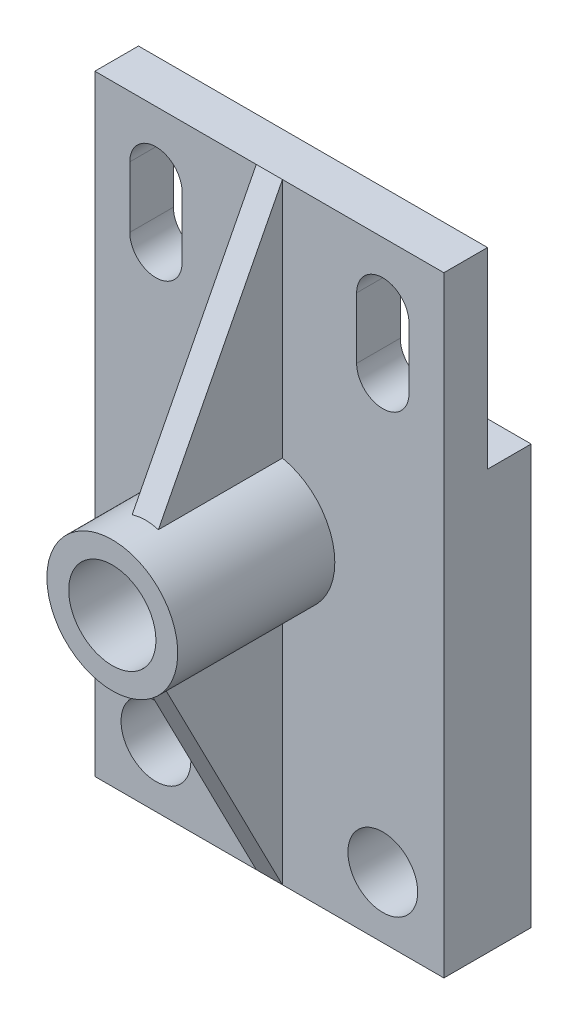
ISO-10303-21;
HEADER;
FILE_DESCRIPTION(('STEP AP214'),'2;1');
FILE_NAME('part.step','',(''),(''),'','','');
FILE_SCHEMA(('AUTOMOTIVE_DESIGN { 1 0 10303 214 1 1 1 1 }'));
ENDSEC;
DATA;
#1=APPLICATION_CONTEXT('core data for automotive mechanical design processes');
#2=APPLICATION_PROTOCOL_DEFINITION('international standard','automotive_design',2000,#1);
#3=PRODUCT_CONTEXT('',#1,'mechanical');
#4=PRODUCT('Part','Part','',(#3));
#5=PRODUCT_RELATED_PRODUCT_CATEGORY('part','',(#4));
#6=PRODUCT_DEFINITION_FORMATION('','',#4);
#7=PRODUCT_DEFINITION_CONTEXT('part definition',#1,'design');
#8=PRODUCT_DEFINITION('design','',#6,#7);
#9=PRODUCT_DEFINITION_SHAPE('','',#8);
#10=(LENGTH_UNIT() NAMED_UNIT(*) SI_UNIT(.MILLI.,.METRE.));
#11=(NAMED_UNIT(*) PLANE_ANGLE_UNIT() SI_UNIT($,.RADIAN.));
#12=(NAMED_UNIT(*) SI_UNIT($,.STERADIAN.) SOLID_ANGLE_UNIT());
#13=UNCERTAINTY_MEASURE_WITH_UNIT(LENGTH_MEASURE(1.E-05),#10,'distance_accuracy_value','');
#14=(GEOMETRIC_REPRESENTATION_CONTEXT(3) GLOBAL_UNCERTAINTY_ASSIGNED_CONTEXT((#13)) GLOBAL_UNIT_ASSIGNED_CONTEXT((#10,
#11,#12)) REPRESENTATION_CONTEXT('',''));
#15=CARTESIAN_POINT('',(0.,0.,0.));
#16=DIRECTION('',(0.,0.,1.));
#17=DIRECTION('',(1.,0.,0.));
#18=AXIS2_PLACEMENT_3D('',#15,#16,#17);
#19=CARTESIAN_POINT('',(0.,0.,28.));
#20=DIRECTION('',(0.,0.,1.));
#21=DIRECTION('',(1.,0.,0.));
#22=AXIS2_PLACEMENT_3D('',#19,#20,#21);
#23=PLANE('',#22);
#24=CARTESIAN_POINT('',(0.,0.,28.));
#25=DIRECTION('',(0.,0.,1.));
#26=DIRECTION('',(1.,0.,0.));
#27=AXIS2_PLACEMENT_3D('',#24,#25,#26);
#28=CIRCLE('',#27,5.);
#29=CARTESIAN_POINT('',(5.,0.,28.));
#30=VERTEX_POINT('',#29);
#31=EDGE_CURVE('E472',#30,#30,#28,.T.);
#32=ORIENTED_EDGE('',*,*,#31,.F.);
#33=EDGE_LOOP('',(#32));
#34=FACE_BOUND('',#33,.T.);
#35=CARTESIAN_POINT('',(0.,0.,28.));
#36=DIRECTION('',(0.,0.,-1.));
#37=DIRECTION('',(-1.,0.,0.));
#38=AXIS2_PLACEMENT_3D('',#35,#36,#37);
#39=CIRCLE('',#38,7.5);
#40=CARTESIAN_POINT('',(-7.5,0.,28.));
#41=VERTEX_POINT('',#40);
#42=EDGE_CURVE('E475',#41,#41,#39,.T.);
#43=ORIENTED_EDGE('',*,*,#42,.F.);
#44=EDGE_LOOP('',(#43));
#45=FACE_BOUND('',#44,.T.);
#46=ADVANCED_FACE('F46',(#34,#45),#23,.T.);
#47=CARTESIAN_POINT('',(0.,0.,10.));
#48=DIRECTION('',(0.,0.,-1.));
#49=DIRECTION('',(-1.,0.,0.));
#50=AXIS2_PLACEMENT_3D('',#47,#48,#49);
#51=PLANE('',#50);
#52=CARTESIAN_POINT('',(13.,21.,10.));
#53=DIRECTION('',(0.,0.,1.));
#54=DIRECTION('',(1.,0.,0.));
#55=AXIS2_PLACEMENT_3D('',#52,#53,#54);
#56=CIRCLE('',#55,3.);
#57=CARTESIAN_POINT('',(10.,21.,10.));
#58=VERTEX_POINT('',#57);
#59=CARTESIAN_POINT('',(16.,21.,10.));
#60=VERTEX_POINT('',#59);
#61=EDGE_CURVE('E288',#58,#60,#56,.T.);
#62=ORIENTED_EDGE('',*,*,#61,.F.);
#63=DIRECTION('',(0.,-1.,0.));
#64=VECTOR('',#63,1.);
#65=CARTESIAN_POINT('',(10.,21.,10.));
#66=LINE('',#65,#64);
#67=CARTESIAN_POINT('',(10.,28.,10.));
#68=VERTEX_POINT('',#67);
#69=EDGE_CURVE('E295',#68,#58,#66,.T.);
#70=ORIENTED_EDGE('',*,*,#69,.F.);
#71=CARTESIAN_POINT('',(13.,28.,10.));
#72=DIRECTION('',(0.,0.,1.));
#73=DIRECTION('',(1.,0.,0.));
#74=AXIS2_PLACEMENT_3D('',#71,#72,#73);
#75=CIRCLE('',#74,3.);
#76=CARTESIAN_POINT('',(16.,28.,10.));
#77=VERTEX_POINT('',#76);
#78=EDGE_CURVE('E292',#77,#68,#75,.T.);
#79=ORIENTED_EDGE('',*,*,#78,.F.);
#80=DIRECTION('',(0.,1.,0.));
#81=VECTOR('',#80,1.);
#82=CARTESIAN_POINT('',(16.,21.,10.));
#83=LINE('',#82,#81);
#84=EDGE_CURVE('E290',#60,#77,#83,.T.);
#85=ORIENTED_EDGE('',*,*,#84,.F.);
#86=EDGE_LOOP('',(#62,#70,#79,#85));
#87=FACE_BOUND('',#86,.T.);
#88=CARTESIAN_POINT('',(13.,-28.,10.));
#89=DIRECTION('',(0.,0.,1.));
#90=DIRECTION('',(1.,0.,0.));
#91=AXIS2_PLACEMENT_3D('',#88,#89,#90);
#92=CIRCLE('',#91,4.);
#93=CARTESIAN_POINT('',(17.,-28.,10.));
#94=VERTEX_POINT('',#93);
#95=EDGE_CURVE('E316',#94,#94,#92,.T.);
#96=ORIENTED_EDGE('',*,*,#95,.F.);
#97=EDGE_LOOP('',(#96));
#98=FACE_BOUND('',#97,.T.);
#99=DIRECTION('',(0.,1.,0.));
#100=VECTOR('',#99,1.);
#101=CARTESIAN_POINT('',(1.5,35.,10.));
#102=LINE('',#101,#100);
#103=CARTESIAN_POINT('',(1.5,-35.,10.));
#104=VERTEX_POINT('',#103);
#105=CARTESIAN_POINT('',(1.5,-7.34846922834953,10.));
#106=VERTEX_POINT('',#105);
#107=EDGE_CURVE('E197',#104,#106,#102,.T.);
#108=ORIENTED_EDGE('',*,*,#107,.F.);
#109=DIRECTION('',(1.,0.,0.));
#110=VECTOR('',#109,1.);
#111=CARTESIAN_POINT('',(-20.,-35.,10.));
#112=LINE('',#111,#110);
#113=CARTESIAN_POINT('',(20.,-35.,10.));
#114=VERTEX_POINT('',#113);
#115=EDGE_CURVE('E180',#104,#114,#112,.T.);
#116=ORIENTED_EDGE('',*,*,#115,.T.);
#117=DIRECTION('',(0.,1.,0.));
#118=VECTOR('',#117,1.);
#119=CARTESIAN_POINT('',(20.,-35.,10.));
#120=LINE('',#119,#118);
#121=CARTESIAN_POINT('',(20.,35.,10.));
#122=VERTEX_POINT('',#121);
#123=EDGE_CURVE('E322',#114,#122,#120,.T.);
#124=ORIENTED_EDGE('',*,*,#123,.T.);
#125=DIRECTION('',(-1.,0.,0.));
#126=VECTOR('',#125,1.);
#127=CARTESIAN_POINT('',(-20.,35.,10.));
#128=LINE('',#127,#126);
#129=CARTESIAN_POINT('',(1.5,35.,10.));
#130=VERTEX_POINT('',#129);
#131=EDGE_CURVE('E326',#122,#130,#128,.T.);
#132=ORIENTED_EDGE('',*,*,#131,.T.);
#133=CARTESIAN_POINT('',(1.5,7.34846922834953,10.));
#134=VERTEX_POINT('',#133);
#135=EDGE_CURVE('E203',#134,#130,#102,.T.);
#136=ORIENTED_EDGE('',*,*,#135,.F.);
#137=CARTESIAN_POINT('',(0.,0.,10.));
#138=DIRECTION('',(0.,0.,-1.));
#139=DIRECTION('',(-1.,0.,0.));
#140=AXIS2_PLACEMENT_3D('',#137,#138,#139);
#141=CIRCLE('',#140,7.5);
#142=EDGE_CURVE('E13',#106,#134,#141,.F.);
#143=ORIENTED_EDGE('',*,*,#142,.F.);
#144=EDGE_LOOP('',(#108,#116,#124,#132,#136,#143));
#145=FACE_BOUND('',#144,.T.);
#146=ADVANCED_FACE('F199',(#87,#98,#145),#51,.F.);
#147=CARTESIAN_POINT('',(0.,0.,28.));
#148=DIRECTION('',(0.,0.,-1.));
#149=DIRECTION('',(-1.,0.,0.));
#150=AXIS2_PLACEMENT_3D('',#147,#148,#149);
#151=CYLINDRICAL_SURFACE('',#150,7.5);
#152=CARTESIAN_POINT('',(0.,0.,28.));
#153=DIRECTION('',(0.,0.457348012620761,0.889287802318147));
#154=DIRECTION('',(0.,0.889287802318147,-0.457348012620761));
#155=AXIS2_PLACEMENT_3D('',#152,#153,#154);
#156=ELLIPSE('',#155,8.43371513749475,7.5);
#157=CARTESIAN_POINT('',(1.5,7.34846922834953,24.2207872539917));
#158=VERTEX_POINT('',#157);
#159=CARTESIAN_POINT('',(-1.5,7.34846922834955,24.2207872539917));
#160=VERTEX_POINT('',#159);
#161=EDGE_CURVE('E61',#158,#160,#156,.T.);
#162=ORIENTED_EDGE('',*,*,#161,.T.);
#163=DIRECTION('',(0.,0.,-1.));
#164=VECTOR('',#163,1.);
#165=CARTESIAN_POINT('',(-1.5,7.34846922834953,28.));
#166=LINE('',#165,#164);
#167=CARTESIAN_POINT('',(-1.5,7.34846922834953,10.));
#168=VERTEX_POINT('',#167);
#169=EDGE_CURVE('E230',#160,#168,#166,.T.);
#170=ORIENTED_EDGE('',*,*,#169,.T.);
#171=CARTESIAN_POINT('',(-1.5,-7.34846922834953,10.));
#172=VERTEX_POINT('',#171);
#173=EDGE_CURVE('E50',#168,#172,#141,.F.);
#174=ORIENTED_EDGE('',*,*,#173,.T.);
#175=DIRECTION('',(0.,0.,-1.));
#176=VECTOR('',#175,1.);
#177=CARTESIAN_POINT('',(-1.5,-7.34846922834953,28.));
#178=LINE('',#177,#176);
#179=CARTESIAN_POINT('',(-1.5,-7.34846922834953,24.2207872539917));
#180=VERTEX_POINT('',#179);
#181=EDGE_CURVE('E228',#172,#180,#178,.F.);
#182=ORIENTED_EDGE('',*,*,#181,.T.);
#183=CARTESIAN_POINT('',(0.,0.,28.));
#184=DIRECTION('',(0.,-0.457348012620761,0.889287802318147));
#185=DIRECTION('',(0.,-0.889287802318147,-0.457348012620761));
#186=AXIS2_PLACEMENT_3D('',#183,#184,#185);
#187=ELLIPSE('',#186,8.43371513749475,7.5);
#188=CARTESIAN_POINT('',(1.5,-7.34846922834953,24.2207872539917));
#189=VERTEX_POINT('',#188);
#190=EDGE_CURVE('E233',#180,#189,#187,.T.);
#191=ORIENTED_EDGE('',*,*,#190,.T.);
#192=DIRECTION('',(0.,0.,-1.));
#193=VECTOR('',#192,1.);
#194=CARTESIAN_POINT('',(1.5,-7.34846922834953,28.));
#195=LINE('',#194,#193);
#196=EDGE_CURVE('E208',#106,#189,#195,.F.);
#197=ORIENTED_EDGE('',*,*,#196,.F.);
#198=ORIENTED_EDGE('',*,*,#142,.T.);
#199=DIRECTION('',(0.,0.,-1.));
#200=VECTOR('',#199,1.);
#201=CARTESIAN_POINT('',(1.5,7.34846922834953,28.));
#202=LINE('',#201,#200);
#203=EDGE_CURVE('E65',#158,#134,#202,.T.);
#204=ORIENTED_EDGE('',*,*,#203,.F.);
#205=EDGE_LOOP('',(#162,#170,#174,#182,#191,#197,#198,#204));
#206=FACE_BOUND('',#205,.T.);
#207=ORIENTED_EDGE('',*,*,#42,.T.);
#208=EDGE_LOOP('',(#207));
#209=FACE_BOUND('',#208,.T.);
#210=ADVANCED_FACE('F351',(#206,#209),#151,.T.);
#211=CARTESIAN_POINT('',(-13.,21.,10.));
#212=DIRECTION('',(0.,0.,1.));
#213=DIRECTION('',(1.,0.,0.));
#214=AXIS2_PLACEMENT_3D('',#211,#212,#213);
#215=CIRCLE('',#214,3.);
#216=CARTESIAN_POINT('',(-16.,21.,10.));
#217=VERTEX_POINT('',#216);
#218=CARTESIAN_POINT('',(-10.,21.,10.));
#219=VERTEX_POINT('',#218);
#220=EDGE_CURVE('E267',#217,#219,#215,.T.);
#221=ORIENTED_EDGE('',*,*,#220,.F.);
#222=DIRECTION('',(0.,-1.,0.));
#223=VECTOR('',#222,1.);
#224=CARTESIAN_POINT('',(-16.,21.,10.));
#225=LINE('',#224,#223);
#226=CARTESIAN_POINT('',(-16.,28.,10.));
#227=VERTEX_POINT('',#226);
#228=EDGE_CURVE('E274',#227,#217,#225,.T.);
#229=ORIENTED_EDGE('',*,*,#228,.F.);
#230=CARTESIAN_POINT('',(-13.,28.,10.));
#231=DIRECTION('',(0.,0.,1.));
#232=DIRECTION('',(1.,0.,0.));
#233=AXIS2_PLACEMENT_3D('',#230,#231,#232);
#234=CIRCLE('',#233,3.);
#235=CARTESIAN_POINT('',(-10.,28.,10.));
#236=VERTEX_POINT('',#235);
#237=EDGE_CURVE('E271',#236,#227,#234,.T.);
#238=ORIENTED_EDGE('',*,*,#237,.F.);
#239=DIRECTION('',(0.,1.,0.));
#240=VECTOR('',#239,1.);
#241=CARTESIAN_POINT('',(-10.,21.,10.));
#242=LINE('',#241,#240);
#243=EDGE_CURVE('E269',#219,#236,#242,.T.);
#244=ORIENTED_EDGE('',*,*,#243,.F.);
#245=EDGE_LOOP('',(#221,#229,#238,#244));
#246=FACE_BOUND('',#245,.T.);
#247=CARTESIAN_POINT('',(-13.,-28.,10.));
#248=DIRECTION('',(0.,0.,1.));
#249=DIRECTION('',(1.,0.,0.));
#250=AXIS2_PLACEMENT_3D('',#247,#248,#249);
#251=CIRCLE('',#250,4.);
#252=CARTESIAN_POINT('',(-9.,-28.,10.));
#253=VERTEX_POINT('',#252);
#254=EDGE_CURVE('E310',#253,#253,#251,.T.);
#255=ORIENTED_EDGE('',*,*,#254,.F.);
#256=EDGE_LOOP('',(#255));
#257=FACE_BOUND('',#256,.T.);
#258=CARTESIAN_POINT('',(-20.,-35.,10.));
#259=VERTEX_POINT('',#258);
#260=CARTESIAN_POINT('',(-1.5,-35.,10.));
#261=VERTEX_POINT('',#260);
#262=EDGE_CURVE('E192',#259,#261,#112,.T.);
#263=ORIENTED_EDGE('',*,*,#262,.T.);
#264=DIRECTION('',(0.,1.,0.));
#265=VECTOR('',#264,1.);
#266=CARTESIAN_POINT('',(-1.5,35.,10.));
#267=LINE('',#266,#265);
#268=EDGE_CURVE('E223',#261,#172,#267,.T.);
#269=ORIENTED_EDGE('',*,*,#268,.T.);
#270=ORIENTED_EDGE('',*,*,#173,.F.);
#271=CARTESIAN_POINT('',(-1.5,35.,10.));
#272=VERTEX_POINT('',#271);
#273=EDGE_CURVE('E358',#168,#272,#267,.T.);
#274=ORIENTED_EDGE('',*,*,#273,.T.);
#275=CARTESIAN_POINT('',(-20.,35.,10.));
#276=VERTEX_POINT('',#275);
#277=EDGE_CURVE('E324',#272,#276,#128,.T.);
#278=ORIENTED_EDGE('',*,*,#277,.T.);
#279=DIRECTION('',(0.,-1.,0.));
#280=VECTOR('',#279,1.);
#281=CARTESIAN_POINT('',(-20.,-35.,10.));
#282=LINE('',#281,#280);
#283=EDGE_CURVE('E193',#276,#259,#282,.T.);
#284=ORIENTED_EDGE('',*,*,#283,.T.);
#285=EDGE_LOOP('',(#263,#269,#270,#274,#278,#284));
#286=FACE_BOUND('',#285,.T.);
#287=ADVANCED_FACE('F363',(#246,#257,#286),#51,.F.);
#288=CARTESIAN_POINT('',(0.,0.,0.));
#289=DIRECTION('',(0.,0.,-1.));
#290=DIRECTION('',(-1.,0.,0.));
#291=AXIS2_PLACEMENT_3D('',#288,#289,#290);
#292=PLANE('',#291);
#293=CARTESIAN_POINT('',(0.,0.,0.));
#294=DIRECTION('',(0.,0.,1.));
#295=DIRECTION('',(1.,0.,0.));
#296=AXIS2_PLACEMENT_3D('',#293,#294,#295);
#297=CIRCLE('',#296,5.);
#298=CARTESIAN_POINT('',(5.,0.,0.));
#299=VERTEX_POINT('',#298);
#300=EDGE_CURVE('E211',#299,#299,#297,.T.);
#301=ORIENTED_EDGE('',*,*,#300,.T.);
#302=EDGE_LOOP('',(#301));
#303=FACE_BOUND('',#302,.T.);
#304=DIRECTION('',(1.,0.,0.));
#305=VECTOR('',#304,1.);
#306=CARTESIAN_POINT('',(-20.,13.,0.));
#307=LINE('',#306,#305);
#308=CARTESIAN_POINT('',(-20.,13.,0.));
#309=VERTEX_POINT('',#308);
#310=CARTESIAN_POINT('',(20.,13.,0.));
#311=VERTEX_POINT('',#310);
#312=EDGE_CURVE('E247',#309,#311,#307,.T.);
#313=ORIENTED_EDGE('',*,*,#312,.T.);
#314=DIRECTION('',(0.,1.,0.));
#315=VECTOR('',#314,1.);
#316=CARTESIAN_POINT('',(20.,-35.,0.));
#317=LINE('',#316,#315);
#318=CARTESIAN_POINT('',(20.,-35.,0.));
#319=VERTEX_POINT('',#318);
#320=EDGE_CURVE('E319',#319,#311,#317,.T.);
#321=ORIENTED_EDGE('',*,*,#320,.F.);
#322=DIRECTION('',(1.,0.,0.));
#323=VECTOR('',#322,1.);
#324=CARTESIAN_POINT('',(-20.,-35.,0.));
#325=LINE('',#324,#323);
#326=CARTESIAN_POINT('',(-20.,-35.,0.));
#327=VERTEX_POINT('',#326);
#328=EDGE_CURVE('E325',#327,#319,#325,.T.);
#329=ORIENTED_EDGE('',*,*,#328,.F.);
#330=DIRECTION('',(0.,-1.,0.));
#331=VECTOR('',#330,1.);
#332=CARTESIAN_POINT('',(-20.,-35.,0.));
#333=LINE('',#332,#331);
#334=EDGE_CURVE('E332',#309,#327,#333,.T.);
#335=ORIENTED_EDGE('',*,*,#334,.F.);
#336=EDGE_LOOP('',(#313,#321,#329,#335));
#337=FACE_BOUND('',#336,.T.);
#338=CARTESIAN_POINT('',(13.,-28.,0.));
#339=DIRECTION('',(0.,0.,1.));
#340=DIRECTION('',(1.,0.,0.));
#341=AXIS2_PLACEMENT_3D('',#338,#339,#340);
#342=CIRCLE('',#341,4.);
#343=CARTESIAN_POINT('',(17.,-28.,0.));
#344=VERTEX_POINT('',#343);
#345=EDGE_CURVE('E313',#344,#344,#342,.T.);
#346=ORIENTED_EDGE('',*,*,#345,.T.);
#347=EDGE_LOOP('',(#346));
#348=FACE_BOUND('',#347,.T.);
#349=CARTESIAN_POINT('',(-13.,-28.,0.));
#350=DIRECTION('',(0.,0.,1.));
#351=DIRECTION('',(1.,0.,0.));
#352=AXIS2_PLACEMENT_3D('',#349,#350,#351);
#353=CIRCLE('',#352,4.);
#354=CARTESIAN_POINT('',(-9.,-28.,0.));
#355=VERTEX_POINT('',#354);
#356=EDGE_CURVE('E309',#355,#355,#353,.T.);
#357=ORIENTED_EDGE('',*,*,#356,.T.);
#358=EDGE_LOOP('',(#357));
#359=FACE_BOUND('',#358,.T.);
#360=ADVANCED_FACE('F371',(#303,#337,#348,#359),#292,.T.);
#361=CARTESIAN_POINT('',(20.,-35.,10.));
#362=DIRECTION('',(-1.,0.,0.));
#363=DIRECTION('',(0.,0.,1.));
#364=AXIS2_PLACEMENT_3D('',#361,#362,#363);
#365=PLANE('',#364);
#366=ORIENTED_EDGE('',*,*,#320,.T.);
#367=DIRECTION('',(0.,0.,-1.));
#368=VECTOR('',#367,1.);
#369=CARTESIAN_POINT('',(20.,13.,0.));
#370=LINE('',#369,#368);
#371=CARTESIAN_POINT('',(20.,13.,5.));
#372=VERTEX_POINT('',#371);
#373=EDGE_CURVE('E240',#372,#311,#370,.T.);
#374=ORIENTED_EDGE('',*,*,#373,.F.);
#375=DIRECTION('',(0.,-1.,0.));
#376=VECTOR('',#375,1.);
#377=CARTESIAN_POINT('',(20.,35.,5.));
#378=LINE('',#377,#376);
#379=CARTESIAN_POINT('',(20.,35.,5.));
#380=VERTEX_POINT('',#379);
#381=EDGE_CURVE('E235',#380,#372,#378,.T.);
#382=ORIENTED_EDGE('',*,*,#381,.F.);
#383=DIRECTION('',(0.,0.,-1.));
#384=VECTOR('',#383,1.);
#385=CARTESIAN_POINT('',(20.,35.,10.));
#386=LINE('',#385,#384);
#387=EDGE_CURVE('E342',#122,#380,#386,.T.);
#388=ORIENTED_EDGE('',*,*,#387,.F.);
#389=ORIENTED_EDGE('',*,*,#123,.F.);
#390=DIRECTION('',(0.,0.,-1.));
#391=VECTOR('',#390,1.);
#392=CARTESIAN_POINT('',(20.,-35.,10.));
#393=LINE('',#392,#391);
#394=EDGE_CURVE('E188',#114,#319,#393,.T.);
#395=ORIENTED_EDGE('',*,*,#394,.T.);
#396=EDGE_LOOP('',(#366,#374,#382,#388,#389,#395));
#397=FACE_BOUND('',#396,.T.);
#398=ADVANCED_FACE('F48',(#397),#365,.F.);
#399=CARTESIAN_POINT('',(-20.,35.,10.));
#400=DIRECTION('',(0.,-1.,0.));
#401=DIRECTION('',(0.,0.,-1.));
#402=AXIS2_PLACEMENT_3D('',#399,#400,#401);
#403=PLANE('',#402);
#404=ORIENTED_EDGE('',*,*,#387,.T.);
#405=DIRECTION('',(1.,0.,0.));
#406=VECTOR('',#405,1.);
#407=CARTESIAN_POINT('',(-20.,35.,5.));
#408=LINE('',#407,#406);
#409=CARTESIAN_POINT('',(-20.,35.,5.));
#410=VERTEX_POINT('',#409);
#411=EDGE_CURVE('E243',#410,#380,#408,.T.);
#412=ORIENTED_EDGE('',*,*,#411,.F.);
#413=DIRECTION('',(0.,0.,-1.));
#414=VECTOR('',#413,1.);
#415=CARTESIAN_POINT('',(-20.,35.,10.));
#416=LINE('',#415,#414);
#417=EDGE_CURVE('E339',#276,#410,#416,.T.);
#418=ORIENTED_EDGE('',*,*,#417,.F.);
#419=ORIENTED_EDGE('',*,*,#277,.F.);
#420=DIRECTION('',(1.,0.,0.));
#421=VECTOR('',#420,1.);
#422=CARTESIAN_POINT('',(-1.5,35.,10.));
#423=LINE('',#422,#421);
#424=EDGE_CURVE('E218',#272,#130,#423,.T.);
#425=ORIENTED_EDGE('',*,*,#424,.T.);
#426=ORIENTED_EDGE('',*,*,#131,.F.);
#427=EDGE_LOOP('',(#404,#412,#418,#419,#425,#426));
#428=FACE_BOUND('',#427,.T.);
#429=ADVANCED_FACE('F390',(#428),#403,.F.);
#430=CARTESIAN_POINT('',(-20.,-35.,10.));
#431=DIRECTION('',(1.,0.,0.));
#432=DIRECTION('',(0.,0.,-1.));
#433=AXIS2_PLACEMENT_3D('',#430,#431,#432);
#434=PLANE('',#433);
#435=DIRECTION('',(0.,-1.,0.));
#436=VECTOR('',#435,1.);
#437=CARTESIAN_POINT('',(-20.,35.,5.));
#438=LINE('',#437,#436);
#439=CARTESIAN_POINT('',(-20.,13.,5.));
#440=VERTEX_POINT('',#439);
#441=EDGE_CURVE('E236',#410,#440,#438,.T.);
#442=ORIENTED_EDGE('',*,*,#441,.T.);
#443=DIRECTION('',(0.,0.,-1.));
#444=VECTOR('',#443,1.);
#445=CARTESIAN_POINT('',(-20.,13.,0.));
#446=LINE('',#445,#444);
#447=EDGE_CURVE('E239',#440,#309,#446,.T.);
#448=ORIENTED_EDGE('',*,*,#447,.T.);
#449=ORIENTED_EDGE('',*,*,#334,.T.);
#450=DIRECTION('',(0.,0.,-1.));
#451=VECTOR('',#450,1.);
#452=CARTESIAN_POINT('',(-20.,-35.,10.));
#453=LINE('',#452,#451);
#454=EDGE_CURVE('E336',#259,#327,#453,.T.);
#455=ORIENTED_EDGE('',*,*,#454,.F.);
#456=ORIENTED_EDGE('',*,*,#283,.F.);
#457=ORIENTED_EDGE('',*,*,#417,.T.);
#458=EDGE_LOOP('',(#442,#448,#449,#455,#456,#457));
#459=FACE_BOUND('',#458,.T.);
#460=ADVANCED_FACE('F391',(#459),#434,.F.);
#461=CARTESIAN_POINT('',(-20.,-35.,10.));
#462=DIRECTION('',(0.,1.,0.));
#463=DIRECTION('',(0.,0.,1.));
#464=AXIS2_PLACEMENT_3D('',#461,#462,#463);
#465=PLANE('',#464);
#466=ORIENTED_EDGE('',*,*,#328,.T.);
#467=ORIENTED_EDGE('',*,*,#394,.F.);
#468=ORIENTED_EDGE('',*,*,#115,.F.);
#469=DIRECTION('',(1.,0.,0.));
#470=VECTOR('',#469,1.);
#471=CARTESIAN_POINT('',(-1.5,-35.,10.));
#472=LINE('',#471,#470);
#473=EDGE_CURVE('E185',#261,#104,#472,.T.);
#474=ORIENTED_EDGE('',*,*,#473,.F.);
#475=ORIENTED_EDGE('',*,*,#262,.F.);
#476=ORIENTED_EDGE('',*,*,#454,.T.);
#477=EDGE_LOOP('',(#466,#467,#468,#474,#475,#476));
#478=FACE_BOUND('',#477,.T.);
#479=ADVANCED_FACE('F182',(#478),#465,.F.);
#480=CARTESIAN_POINT('',(13.,-28.,10.));
#481=DIRECTION('',(0.,0.,-1.));
#482=DIRECTION('',(-1.,0.,0.));
#483=AXIS2_PLACEMENT_3D('',#480,#481,#482);
#484=CYLINDRICAL_SURFACE('',#483,4.);
#485=ORIENTED_EDGE('',*,*,#95,.T.);
#486=EDGE_LOOP('',(#485));
#487=FACE_BOUND('',#486,.T.);
#488=ORIENTED_EDGE('',*,*,#345,.F.);
#489=EDGE_LOOP('',(#488));
#490=FACE_BOUND('',#489,.T.);
#491=ADVANCED_FACE('F398',(#487,#490),#484,.F.);
#492=CARTESIAN_POINT('',(-13.,-28.,10.));
#493=DIRECTION('',(0.,0.,-1.));
#494=DIRECTION('',(-1.,0.,0.));
#495=AXIS2_PLACEMENT_3D('',#492,#493,#494);
#496=CYLINDRICAL_SURFACE('',#495,4.);
#497=ORIENTED_EDGE('',*,*,#254,.T.);
#498=EDGE_LOOP('',(#497));
#499=FACE_BOUND('',#498,.T.);
#500=ORIENTED_EDGE('',*,*,#356,.F.);
#501=EDGE_LOOP('',(#500));
#502=FACE_BOUND('',#501,.T.);
#503=ADVANCED_FACE('F454',(#499,#502),#496,.F.);
#504=CARTESIAN_POINT('',(13.,21.,10.));
#505=DIRECTION('',(0.,0.,-1.));
#506=DIRECTION('',(-1.,0.,0.));
#507=AXIS2_PLACEMENT_3D('',#504,#505,#506);
#508=CYLINDRICAL_SURFACE('',#507,3.);
#509=CARTESIAN_POINT('',(13.,21.,5.));
#510=DIRECTION('',(0.,0.,1.));
#511=DIRECTION('',(0.,-1.,0.));
#512=AXIS2_PLACEMENT_3D('',#509,#510,#511);
#513=CIRCLE('',#512,3.);
#514=CARTESIAN_POINT('',(10.,21.,5.));
#515=VERTEX_POINT('',#514);
#516=CARTESIAN_POINT('',(16.,21.,5.));
#517=VERTEX_POINT('',#516);
#518=EDGE_CURVE('E265',#515,#517,#513,.T.);
#519=ORIENTED_EDGE('',*,*,#518,.F.);
#520=DIRECTION('',(0.,0.,-1.));
#521=VECTOR('',#520,1.);
#522=CARTESIAN_POINT('',(10.,21.,10.));
#523=LINE('',#522,#521);
#524=EDGE_CURVE('E297',#58,#515,#523,.T.);
#525=ORIENTED_EDGE('',*,*,#524,.F.);
#526=ORIENTED_EDGE('',*,*,#61,.T.);
#527=DIRECTION('',(0.,0.,-1.));
#528=VECTOR('',#527,1.);
#529=CARTESIAN_POINT('',(16.,21.,10.));
#530=LINE('',#529,#528);
#531=EDGE_CURVE('E306',#60,#517,#530,.T.);
#532=ORIENTED_EDGE('',*,*,#531,.T.);
#533=EDGE_LOOP('',(#519,#525,#526,#532));
#534=FACE_BOUND('',#533,.T.);
#535=ADVANCED_FACE('F450',(#534),#508,.F.);
#536=CARTESIAN_POINT('',(16.,21.,10.));
#537=DIRECTION('',(-1.,0.,0.));
#538=DIRECTION('',(0.,0.,1.));
#539=AXIS2_PLACEMENT_3D('',#536,#537,#538);
#540=PLANE('',#539);
#541=DIRECTION('',(0.,1.,0.));
#542=VECTOR('',#541,1.);
#543=CARTESIAN_POINT('',(16.,21.,5.));
#544=LINE('',#543,#542);
#545=CARTESIAN_POINT('',(16.,28.,5.));
#546=VERTEX_POINT('',#545);
#547=EDGE_CURVE('E263',#517,#546,#544,.T.);
#548=ORIENTED_EDGE('',*,*,#547,.F.);
#549=ORIENTED_EDGE('',*,*,#531,.F.);
#550=ORIENTED_EDGE('',*,*,#84,.T.);
#551=DIRECTION('',(0.,0.,-1.));
#552=VECTOR('',#551,1.);
#553=CARTESIAN_POINT('',(16.,28.,10.));
#554=LINE('',#553,#552);
#555=EDGE_CURVE('E303',#77,#546,#554,.T.);
#556=ORIENTED_EDGE('',*,*,#555,.T.);
#557=EDGE_LOOP('',(#548,#549,#550,#556));
#558=FACE_BOUND('',#557,.T.);
#559=ADVANCED_FACE('F446',(#558),#540,.T.);
#560=CARTESIAN_POINT('',(13.,28.,10.));
#561=DIRECTION('',(0.,0.,-1.));
#562=DIRECTION('',(-1.,0.,0.));
#563=AXIS2_PLACEMENT_3D('',#560,#561,#562);
#564=CYLINDRICAL_SURFACE('',#563,3.);
#565=CARTESIAN_POINT('',(13.,28.,5.));
#566=DIRECTION('',(0.,0.,1.));
#567=DIRECTION('',(0.,-1.,0.));
#568=AXIS2_PLACEMENT_3D('',#565,#566,#567);
#569=CIRCLE('',#568,3.);
#570=CARTESIAN_POINT('',(10.,28.,5.));
#571=VERTEX_POINT('',#570);
#572=EDGE_CURVE('E261',#546,#571,#569,.T.);
#573=ORIENTED_EDGE('',*,*,#572,.F.);
#574=ORIENTED_EDGE('',*,*,#555,.F.);
#575=ORIENTED_EDGE('',*,*,#78,.T.);
#576=DIRECTION('',(0.,0.,-1.));
#577=VECTOR('',#576,1.);
#578=CARTESIAN_POINT('',(10.,28.,10.));
#579=LINE('',#578,#577);
#580=EDGE_CURVE('E300',#68,#571,#579,.T.);
#581=ORIENTED_EDGE('',*,*,#580,.T.);
#582=EDGE_LOOP('',(#573,#574,#575,#581));
#583=FACE_BOUND('',#582,.T.);
#584=ADVANCED_FACE('F442',(#583),#564,.F.);
#585=CARTESIAN_POINT('',(10.,21.,10.));
#586=DIRECTION('',(1.,0.,0.));
#587=DIRECTION('',(0.,0.,-1.));
#588=AXIS2_PLACEMENT_3D('',#585,#586,#587);
#589=PLANE('',#588);
#590=DIRECTION('',(0.,-1.,0.));
#591=VECTOR('',#590,1.);
#592=CARTESIAN_POINT('',(10.,21.,5.));
#593=LINE('',#592,#591);
#594=EDGE_CURVE('E259',#571,#515,#593,.T.);
#595=ORIENTED_EDGE('',*,*,#594,.F.);
#596=ORIENTED_EDGE('',*,*,#580,.F.);
#597=ORIENTED_EDGE('',*,*,#69,.T.);
#598=ORIENTED_EDGE('',*,*,#524,.T.);
#599=EDGE_LOOP('',(#595,#596,#597,#598));
#600=FACE_BOUND('',#599,.T.);
#601=ADVANCED_FACE('F438',(#600),#589,.T.);
#602=CARTESIAN_POINT('',(-13.,21.,10.));
#603=DIRECTION('',(0.,0.,-1.));
#604=DIRECTION('',(-1.,0.,0.));
#605=AXIS2_PLACEMENT_3D('',#602,#603,#604);
#606=CYLINDRICAL_SURFACE('',#605,3.);
#607=CARTESIAN_POINT('',(-13.,21.,5.));
#608=DIRECTION('',(0.,0.,1.));
#609=DIRECTION('',(0.,-1.,0.));
#610=AXIS2_PLACEMENT_3D('',#607,#608,#609);
#611=CIRCLE('',#610,3.);
#612=CARTESIAN_POINT('',(-16.,21.,5.));
#613=VERTEX_POINT('',#612);
#614=CARTESIAN_POINT('',(-10.,21.,5.));
#615=VERTEX_POINT('',#614);
#616=EDGE_CURVE('E257',#613,#615,#611,.T.);
#617=ORIENTED_EDGE('',*,*,#616,.F.);
#618=DIRECTION('',(0.,0.,-1.));
#619=VECTOR('',#618,1.);
#620=CARTESIAN_POINT('',(-16.,21.,10.));
#621=LINE('',#620,#619);
#622=EDGE_CURVE('E276',#217,#613,#621,.T.);
#623=ORIENTED_EDGE('',*,*,#622,.F.);
#624=ORIENTED_EDGE('',*,*,#220,.T.);
#625=DIRECTION('',(0.,0.,-1.));
#626=VECTOR('',#625,1.);
#627=CARTESIAN_POINT('',(-10.,21.,10.));
#628=LINE('',#627,#626);
#629=EDGE_CURVE('E285',#219,#615,#628,.T.);
#630=ORIENTED_EDGE('',*,*,#629,.T.);
#631=EDGE_LOOP('',(#617,#623,#624,#630));
#632=FACE_BOUND('',#631,.T.);
#633=ADVANCED_FACE('F434',(#632),#606,.F.);
#634=CARTESIAN_POINT('',(-10.,21.,10.));
#635=DIRECTION('',(-1.,0.,0.));
#636=DIRECTION('',(0.,0.,1.));
#637=AXIS2_PLACEMENT_3D('',#634,#635,#636);
#638=PLANE('',#637);
#639=DIRECTION('',(0.,1.,0.));
#640=VECTOR('',#639,1.);
#641=CARTESIAN_POINT('',(-10.,21.,5.));
#642=LINE('',#641,#640);
#643=CARTESIAN_POINT('',(-10.,28.,5.));
#644=VERTEX_POINT('',#643);
#645=EDGE_CURVE('E255',#615,#644,#642,.T.);
#646=ORIENTED_EDGE('',*,*,#645,.F.);
#647=ORIENTED_EDGE('',*,*,#629,.F.);
#648=ORIENTED_EDGE('',*,*,#243,.T.);
#649=DIRECTION('',(0.,0.,-1.));
#650=VECTOR('',#649,1.);
#651=CARTESIAN_POINT('',(-10.,28.,10.));
#652=LINE('',#651,#650);
#653=EDGE_CURVE('E282',#236,#644,#652,.T.);
#654=ORIENTED_EDGE('',*,*,#653,.T.);
#655=EDGE_LOOP('',(#646,#647,#648,#654));
#656=FACE_BOUND('',#655,.T.);
#657=ADVANCED_FACE('F430',(#656),#638,.T.);
#658=CARTESIAN_POINT('',(-13.,28.,10.));
#659=DIRECTION('',(0.,0.,-1.));
#660=DIRECTION('',(-1.,0.,0.));
#661=AXIS2_PLACEMENT_3D('',#658,#659,#660);
#662=CYLINDRICAL_SURFACE('',#661,3.);
#663=CARTESIAN_POINT('',(-13.,28.,5.));
#664=DIRECTION('',(0.,0.,1.));
#665=DIRECTION('',(0.,-1.,0.));
#666=AXIS2_PLACEMENT_3D('',#663,#664,#665);
#667=CIRCLE('',#666,3.);
#668=CARTESIAN_POINT('',(-16.,28.,5.));
#669=VERTEX_POINT('',#668);
#670=EDGE_CURVE('E250',#644,#669,#667,.T.);
#671=ORIENTED_EDGE('',*,*,#670,.F.);
#672=ORIENTED_EDGE('',*,*,#653,.F.);
#673=ORIENTED_EDGE('',*,*,#237,.T.);
#674=DIRECTION('',(0.,0.,-1.));
#675=VECTOR('',#674,1.);
#676=CARTESIAN_POINT('',(-16.,28.,10.));
#677=LINE('',#676,#675);
#678=EDGE_CURVE('E279',#227,#669,#677,.T.);
#679=ORIENTED_EDGE('',*,*,#678,.T.);
#680=EDGE_LOOP('',(#671,#672,#673,#679));
#681=FACE_BOUND('',#680,.T.);
#682=ADVANCED_FACE('F426',(#681),#662,.F.);
#683=CARTESIAN_POINT('',(-16.,21.,10.));
#684=DIRECTION('',(1.,0.,0.));
#685=DIRECTION('',(0.,0.,-1.));
#686=AXIS2_PLACEMENT_3D('',#683,#684,#685);
#687=PLANE('',#686);
#688=DIRECTION('',(0.,-1.,0.));
#689=VECTOR('',#688,1.);
#690=CARTESIAN_POINT('',(-16.,21.,5.));
#691=LINE('',#690,#689);
#692=EDGE_CURVE('E344',#669,#613,#691,.T.);
#693=ORIENTED_EDGE('',*,*,#692,.F.);
#694=ORIENTED_EDGE('',*,*,#678,.F.);
#695=ORIENTED_EDGE('',*,*,#228,.T.);
#696=ORIENTED_EDGE('',*,*,#622,.T.);
#697=EDGE_LOOP('',(#693,#694,#695,#696));
#698=FACE_BOUND('',#697,.T.);
#699=ADVANCED_FACE('F419',(#698),#687,.T.);
#700=CARTESIAN_POINT('',(-20.,13.,0.));
#701=DIRECTION('',(0.,-1.,0.));
#702=DIRECTION('',(0.,0.,-1.));
#703=AXIS2_PLACEMENT_3D('',#700,#701,#702);
#704=PLANE('',#703);
#705=ORIENTED_EDGE('',*,*,#373,.T.);
#706=ORIENTED_EDGE('',*,*,#312,.F.);
#707=ORIENTED_EDGE('',*,*,#447,.F.);
#708=DIRECTION('',(1.,0.,0.));
#709=VECTOR('',#708,1.);
#710=CARTESIAN_POINT('',(-20.,13.,5.));
#711=LINE('',#710,#709);
#712=EDGE_CURVE('E251',#440,#372,#711,.T.);
#713=ORIENTED_EDGE('',*,*,#712,.T.);
#714=EDGE_LOOP('',(#705,#706,#707,#713));
#715=FACE_BOUND('',#714,.T.);
#716=ADVANCED_FACE('F415',(#715),#704,.F.);
#717=CARTESIAN_POINT('',(-20.,35.,5.));
#718=DIRECTION('',(0.,0.,1.));
#719=DIRECTION('',(0.,-1.,0.));
#720=AXIS2_PLACEMENT_3D('',#717,#718,#719);
#721=PLANE('',#720);
#722=ORIENTED_EDGE('',*,*,#518,.T.);
#723=ORIENTED_EDGE('',*,*,#547,.T.);
#724=ORIENTED_EDGE('',*,*,#572,.T.);
#725=ORIENTED_EDGE('',*,*,#594,.T.);
#726=EDGE_LOOP('',(#722,#723,#724,#725));
#727=FACE_BOUND('',#726,.T.);
#728=ORIENTED_EDGE('',*,*,#616,.T.);
#729=ORIENTED_EDGE('',*,*,#645,.T.);
#730=ORIENTED_EDGE('',*,*,#670,.T.);
#731=ORIENTED_EDGE('',*,*,#692,.T.);
#732=EDGE_LOOP('',(#728,#729,#730,#731));
#733=FACE_BOUND('',#732,.T.);
#734=ORIENTED_EDGE('',*,*,#381,.T.);
#735=ORIENTED_EDGE('',*,*,#712,.F.);
#736=ORIENTED_EDGE('',*,*,#441,.F.);
#737=ORIENTED_EDGE('',*,*,#411,.T.);
#738=EDGE_LOOP('',(#734,#735,#736,#737));
#739=FACE_BOUND('',#738,.T.);
#740=ADVANCED_FACE('F418',(#727,#733,#739),#721,.F.);
#741=CARTESIAN_POINT('',(-1.5,0.,28.));
#742=DIRECTION('',(0.,-0.457348012620761,0.889287802318147));
#743=DIRECTION('',(0.,-0.889287802318147,-0.457348012620761));
#744=AXIS2_PLACEMENT_3D('',#741,#742,#743);
#745=PLANE('',#744);
#746=ORIENTED_EDGE('',*,*,#190,.F.);
#747=DIRECTION('',(0.,-0.889287802318147,-0.457348012620761));
#748=VECTOR('',#747,1.);
#749=CARTESIAN_POINT('',(-1.5,0.,28.));
#750=LINE('',#749,#748);
#751=EDGE_CURVE('E216',#180,#261,#750,.T.);
#752=ORIENTED_EDGE('',*,*,#751,.T.);
#753=ORIENTED_EDGE('',*,*,#473,.T.);
#754=DIRECTION('',(0.,-0.889287802318147,-0.457348012620761));
#755=VECTOR('',#754,1.);
#756=CARTESIAN_POINT('',(1.5,0.,28.));
#757=LINE('',#756,#755);
#758=EDGE_CURVE('E206',#189,#104,#757,.T.);
#759=ORIENTED_EDGE('',*,*,#758,.F.);
#760=EDGE_LOOP('',(#746,#752,#753,#759));
#761=FACE_BOUND('',#760,.T.);
#762=ADVANCED_FACE('F214',(#761),#745,.T.);
#763=CARTESIAN_POINT('',(1.5,0.,0.));
#764=DIRECTION('',(-1.,0.,0.));
#765=DIRECTION('',(0.,0.,1.));
#766=AXIS2_PLACEMENT_3D('',#763,#764,#765);
#767=PLANE('',#766);
#768=ORIENTED_EDGE('',*,*,#107,.T.);
#769=ORIENTED_EDGE('',*,*,#196,.T.);
#770=ORIENTED_EDGE('',*,*,#758,.T.);
#771=EDGE_LOOP('',(#768,#769,#770));
#772=FACE_BOUND('',#771,.T.);
#773=ADVANCED_FACE('F207',(#772),#767,.F.);
#774=CARTESIAN_POINT('',(-1.5,0.,0.));
#775=DIRECTION('',(-1.,0.,0.));
#776=DIRECTION('',(0.,0.,1.));
#777=AXIS2_PLACEMENT_3D('',#774,#775,#776);
#778=PLANE('',#777);
#779=ORIENTED_EDGE('',*,*,#181,.F.);
#780=ORIENTED_EDGE('',*,*,#268,.F.);
#781=ORIENTED_EDGE('',*,*,#751,.F.);
#782=EDGE_LOOP('',(#779,#780,#781));
#783=FACE_BOUND('',#782,.T.);
#784=ADVANCED_FACE('F357',(#783),#778,.T.);
#785=CARTESIAN_POINT('',(-1.5,35.,10.));
#786=DIRECTION('',(0.,0.457348012620761,0.889287802318147));
#787=DIRECTION('',(0.,-0.889287802318147,0.457348012620761));
#788=AXIS2_PLACEMENT_3D('',#785,#786,#787);
#789=PLANE('',#788);
#790=ORIENTED_EDGE('',*,*,#161,.F.);
#791=DIRECTION('',(0.,-0.889287802318147,0.457348012620761));
#792=VECTOR('',#791,1.);
#793=CARTESIAN_POINT('',(1.5,35.,10.));
#794=LINE('',#793,#792);
#795=EDGE_CURVE('E202',#130,#158,#794,.T.);
#796=ORIENTED_EDGE('',*,*,#795,.F.);
#797=ORIENTED_EDGE('',*,*,#424,.F.);
#798=DIRECTION('',(0.,-0.889287802318147,0.457348012620761));
#799=VECTOR('',#798,1.);
#800=CARTESIAN_POINT('',(-1.5,35.,10.));
#801=LINE('',#800,#799);
#802=EDGE_CURVE('E219',#272,#160,#801,.T.);
#803=ORIENTED_EDGE('',*,*,#802,.T.);
#804=EDGE_LOOP('',(#790,#796,#797,#803));
#805=FACE_BOUND('',#804,.T.);
#806=ADVANCED_FACE('F384',(#805),#789,.T.);
#807=ORIENTED_EDGE('',*,*,#169,.F.);
#808=ORIENTED_EDGE('',*,*,#802,.F.);
#809=ORIENTED_EDGE('',*,*,#273,.F.);
#810=EDGE_LOOP('',(#807,#808,#809));
#811=FACE_BOUND('',#810,.T.);
#812=ADVANCED_FACE('F387',(#811),#778,.T.);
#813=ORIENTED_EDGE('',*,*,#795,.T.);
#814=ORIENTED_EDGE('',*,*,#203,.T.);
#815=ORIENTED_EDGE('',*,*,#135,.T.);
#816=EDGE_LOOP('',(#813,#814,#815));
#817=FACE_BOUND('',#816,.T.);
#818=ADVANCED_FACE('F381',(#817),#767,.F.);
#819=CARTESIAN_POINT('',(0.,0.,0.));
#820=DIRECTION('',(0.,0.,1.));
#821=DIRECTION('',(1.,0.,0.));
#822=AXIS2_PLACEMENT_3D('',#819,#820,#821);
#823=CYLINDRICAL_SURFACE('',#822,5.);
#824=ORIENTED_EDGE('',*,*,#300,.F.);
#825=EDGE_LOOP('',(#824));
#826=FACE_BOUND('',#825,.T.);
#827=ORIENTED_EDGE('',*,*,#31,.T.);
#828=EDGE_LOOP('',(#827));
#829=FACE_BOUND('',#828,.T.);
#830=ADVANCED_FACE('F481',(#826,#829),#823,.F.);
#831=CLOSED_SHELL('',(#46,#146,#210,#287,#360,#398,#429,#460,#479,#491,#503,#535,#559,#584,#601,
#633,#657,#682,#699,#716,#740,#762,#773,#784,#806,#812,#818,#830));
#832=MANIFOLD_SOLID_BREP('B2',#831);
#833=ADVANCED_BREP_SHAPE_REPRESENTATION('',(#18,#832),#14);
#834=SHAPE_DEFINITION_REPRESENTATION(#9,#833);
ENDSEC;
END-ISO-10303-21;
